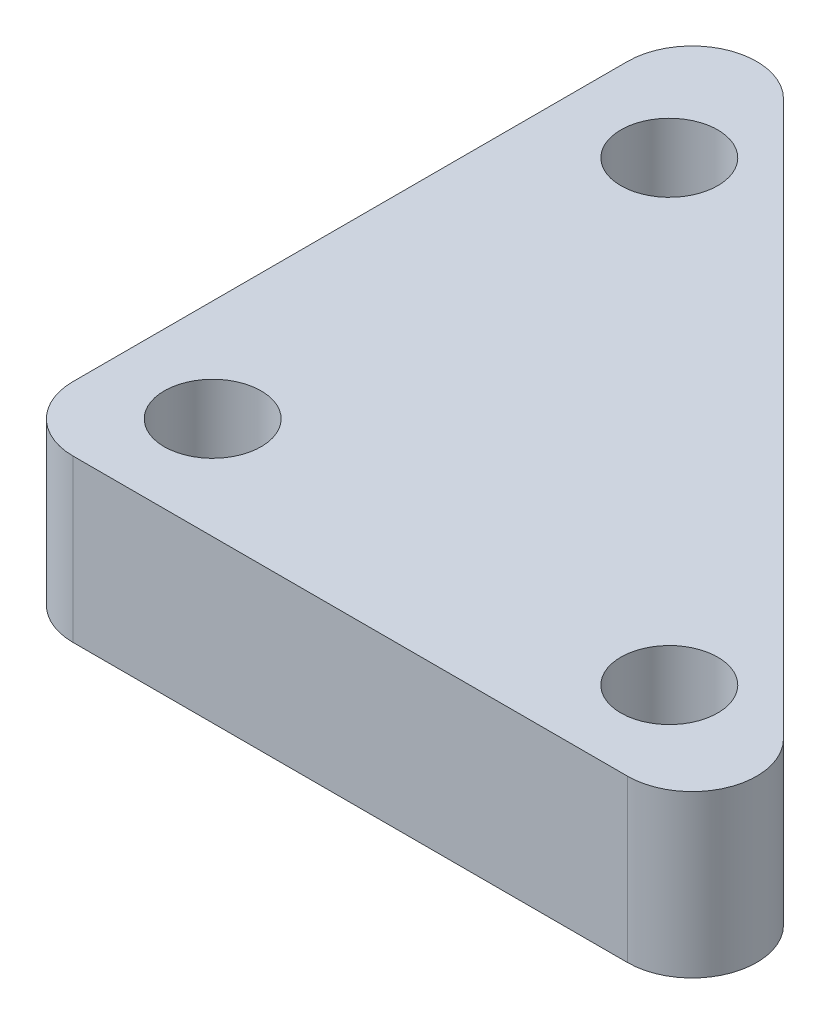
ISO-10303-21;
HEADER;
FILE_DESCRIPTION(('STEP AP214'),'2;1');
FILE_NAME('part.step','',(''),(''),'','','');
FILE_SCHEMA(('AUTOMOTIVE_DESIGN { 1 0 10303 214 1 1 1 1 }'));
ENDSEC;
DATA;
#1=APPLICATION_CONTEXT('core data for automotive mechanical design processes');
#2=APPLICATION_PROTOCOL_DEFINITION('international standard','automotive_design',2000,#1);
#3=PRODUCT_CONTEXT('',#1,'mechanical');
#4=PRODUCT('Part','Part','',(#3));
#5=PRODUCT_RELATED_PRODUCT_CATEGORY('part','',(#4));
#6=PRODUCT_DEFINITION_FORMATION('','',#4);
#7=PRODUCT_DEFINITION_CONTEXT('part definition',#1,'design');
#8=PRODUCT_DEFINITION('design','',#6,#7);
#9=PRODUCT_DEFINITION_SHAPE('','',#8);
#10=(LENGTH_UNIT() NAMED_UNIT(*) SI_UNIT(.MILLI.,.METRE.));
#11=(NAMED_UNIT(*) PLANE_ANGLE_UNIT() SI_UNIT($,.RADIAN.));
#12=(NAMED_UNIT(*) SI_UNIT($,.STERADIAN.) SOLID_ANGLE_UNIT());
#13=UNCERTAINTY_MEASURE_WITH_UNIT(LENGTH_MEASURE(1.E-05),#10,'distance_accuracy_value','');
#14=(GEOMETRIC_REPRESENTATION_CONTEXT(3) GLOBAL_UNCERTAINTY_ASSIGNED_CONTEXT((#13)) GLOBAL_UNIT_ASSIGNED_CONTEXT((#10,
#11,#12)) REPRESENTATION_CONTEXT('',''));
#15=CARTESIAN_POINT('',(0.,0.,0.));
#16=DIRECTION('',(0.,0.,1.));
#17=DIRECTION('',(1.,0.,0.));
#18=AXIS2_PLACEMENT_3D('',#15,#16,#17);
#19=CARTESIAN_POINT('',(-0.813390539394515,5.,17.6790433737398));
#20=DIRECTION('',(1.,0.,0.));
#21=DIRECTION('',(0.,0.,-1.));
#22=AXIS2_PLACEMENT_3D('',#19,#20,#21);
#23=PLANE('',#22);
#24=DIRECTION('',(0.,0.,1.));
#25=VECTOR('',#24,1.);
#26=CARTESIAN_POINT('',(-0.813390539394515,0.,17.6790433737398));
#27=LINE('',#26,#25);
#28=CARTESIAN_POINT('',(-0.813390539394515,0.,-1.49252950151403));
#29=VERTEX_POINT('',#28);
#30=CARTESIAN_POINT('',(-0.813390539394515,0.,15.6790433737398));
#31=VERTEX_POINT('',#30);
#32=EDGE_CURVE('E112',#29,#31,#27,.T.);
#33=ORIENTED_EDGE('',*,*,#32,.T.);
#34=DIRECTION('',(0.,-1.,0.));
#35=VECTOR('',#34,1.);
#36=CARTESIAN_POINT('',(-0.813390539394515,5.,15.6790433737398));
#37=LINE('',#36,#35);
#38=CARTESIAN_POINT('',(-0.813390539394515,5.,15.6790433737398));
#39=VERTEX_POINT('',#38);
#40=EDGE_CURVE('E91',#31,#39,#37,.F.);
#41=ORIENTED_EDGE('',*,*,#40,.T.);
#42=DIRECTION('',(0.,0.,1.));
#43=VECTOR('',#42,1.);
#44=CARTESIAN_POINT('',(-0.813390539394515,5.,17.6790433737398));
#45=LINE('',#44,#43);
#46=CARTESIAN_POINT('',(-0.813390539394515,5.,-1.49252950151403));
#47=VERTEX_POINT('',#46);
#48=EDGE_CURVE('E114',#47,#39,#45,.T.);
#49=ORIENTED_EDGE('',*,*,#48,.F.);
#50=DIRECTION('',(0.,-1.,0.));
#51=VECTOR('',#50,1.);
#52=CARTESIAN_POINT('',(-0.813390539394515,5.,-1.49252950151403));
#53=LINE('',#52,#51);
#54=EDGE_CURVE('E96',#47,#29,#53,.T.);
#55=ORIENTED_EDGE('',*,*,#54,.T.);
#56=EDGE_LOOP('',(#33,#41,#49,#55));
#57=FACE_BOUND('',#56,.T.);
#58=ADVANCED_FACE('F33',(#57),#23,.F.);
#59=CARTESIAN_POINT('',(-0.813390539394515,5.,17.6790433737398));
#60=DIRECTION('',(0.,0.,-1.));
#61=DIRECTION('',(-1.,0.,0.));
#62=AXIS2_PLACEMENT_3D('',#59,#60,#61);
#63=PLANE('',#62);
#64=DIRECTION('',(1.,0.,0.));
#65=VECTOR('',#64,1.);
#66=CARTESIAN_POINT('',(-0.813390539394515,5.,17.6790433737398));
#67=LINE('',#66,#65);
#68=CARTESIAN_POINT('',(1.18660946060549,5.,17.6790433737398));
#69=VERTEX_POINT('',#68);
#70=CARTESIAN_POINT('',(18.3581823358593,5.,17.6790433737398));
#71=VERTEX_POINT('',#70);
#72=EDGE_CURVE('E105',#69,#71,#67,.T.);
#73=ORIENTED_EDGE('',*,*,#72,.F.);
#74=DIRECTION('',(0.,-1.,0.));
#75=VECTOR('',#74,1.);
#76=CARTESIAN_POINT('',(1.18660946060549,5.,17.6790433737398));
#77=LINE('',#76,#75);
#78=CARTESIAN_POINT('',(1.18660946060549,0.,17.6790433737398));
#79=VERTEX_POINT('',#78);
#80=EDGE_CURVE('E90',#69,#79,#77,.T.);
#81=ORIENTED_EDGE('',*,*,#80,.T.);
#82=DIRECTION('',(1.,0.,0.));
#83=VECTOR('',#82,1.);
#84=CARTESIAN_POINT('',(-0.813390539394515,0.,17.6790433737398));
#85=LINE('',#84,#83);
#86=CARTESIAN_POINT('',(18.3581823358593,0.,17.6790433737398));
#87=VERTEX_POINT('',#86);
#88=EDGE_CURVE('E103',#79,#87,#85,.T.);
#89=ORIENTED_EDGE('',*,*,#88,.T.);
#90=DIRECTION('',(0.,-1.,0.));
#91=VECTOR('',#90,1.);
#92=CARTESIAN_POINT('',(18.3581823358593,5.,17.6790433737398));
#93=LINE('',#92,#91);
#94=EDGE_CURVE('E107',#87,#71,#93,.F.);
#95=ORIENTED_EDGE('',*,*,#94,.T.);
#96=EDGE_LOOP('',(#73,#81,#89,#95));
#97=FACE_BOUND('',#96,.T.);
#98=ADVANCED_FACE('F102',(#97),#63,.F.);
#99=CARTESIAN_POINT('',(-0.813390539394515,5.,-6.32095662626022));
#100=DIRECTION('',(-0.707106781186548,0.,0.707106781186548));
#101=DIRECTION('',(0.707106781186548,0.,0.707106781186548));
#102=AXIS2_PLACEMENT_3D('',#99,#100,#101);
#103=PLANE('',#102);
#104=DIRECTION('',(-0.707106781186548,0.,-0.707106781186548));
#105=VECTOR('',#104,1.);
#106=CARTESIAN_POINT('',(-0.813390539394515,0.,-6.32095662626022));
#107=LINE('',#106,#105);
#108=CARTESIAN_POINT('',(19.7723958982324,0.,14.2648298113667));
#109=VERTEX_POINT('',#108);
#110=CARTESIAN_POINT('',(2.60082302297858,0.,-2.90674306388713));
#111=VERTEX_POINT('',#110);
#112=EDGE_CURVE('E111',#109,#111,#107,.T.);
#113=ORIENTED_EDGE('',*,*,#112,.T.);
#114=DIRECTION('',(0.,-1.,0.));
#115=VECTOR('',#114,1.);
#116=CARTESIAN_POINT('',(2.60082302297858,5.,-2.90674306388713));
#117=LINE('',#116,#115);
#118=CARTESIAN_POINT('',(2.60082302297858,5.,-2.90674306388713));
#119=VERTEX_POINT('',#118);
#120=EDGE_CURVE('E11',#111,#119,#117,.F.);
#121=ORIENTED_EDGE('',*,*,#120,.T.);
#122=DIRECTION('',(-0.707106781186548,0.,-0.707106781186548));
#123=VECTOR('',#122,1.);
#124=CARTESIAN_POINT('',(-0.813390539394515,5.,-6.32095662626022));
#125=LINE('',#124,#123);
#126=CARTESIAN_POINT('',(19.7723958982324,5.,14.2648298113667));
#127=VERTEX_POINT('',#126);
#128=EDGE_CURVE('E120',#127,#119,#125,.T.);
#129=ORIENTED_EDGE('',*,*,#128,.F.);
#130=DIRECTION('',(0.,-1.,0.));
#131=VECTOR('',#130,1.);
#132=CARTESIAN_POINT('',(19.7723958982324,5.,14.2648298113667));
#133=LINE('',#132,#131);
#134=EDGE_CURVE('E41',#127,#109,#133,.T.);
#135=ORIENTED_EDGE('',*,*,#134,.T.);
#136=EDGE_LOOP('',(#113,#121,#129,#135));
#137=FACE_BOUND('',#136,.T.);
#138=ADVANCED_FACE('F133',(#137),#103,.F.);
#139=CARTESIAN_POINT('',(0.,5.,0.));
#140=DIRECTION('',(0.,-1.,0.));
#141=DIRECTION('',(0.,0.,-1.));
#142=AXIS2_PLACEMENT_3D('',#139,#140,#141);
#143=PLANE('',#142);
#144=CARTESIAN_POINT('',(16.5603777134606,5.,14.5883455325277));
#145=DIRECTION('',(0.,1.,0.));
#146=DIRECTION('',(0.,0.,1.));
#147=AXIS2_PLACEMENT_3D('',#144,#145,#146);
#148=CIRCLE('',#147,1.5);
#149=CARTESIAN_POINT('',(16.5603777134606,5.,16.0883455325277));
#150=VERTEX_POINT('',#149);
#151=EDGE_CURVE('E197',#150,#150,#148,.T.);
#152=ORIENTED_EDGE('',*,*,#151,.F.);
#153=EDGE_LOOP('',(#152));
#154=FACE_BOUND('',#153,.T.);
#155=CARTESIAN_POINT('',(2.41824208972967,5.,0.446209908796702));
#156=DIRECTION('',(0.,1.,0.));
#157=DIRECTION('',(0.,0.,1.));
#158=AXIS2_PLACEMENT_3D('',#155,#156,#157);
#159=CIRCLE('',#158,1.5);
#160=CARTESIAN_POINT('',(2.41824208972967,5.,1.9462099087967));
#161=VERTEX_POINT('',#160);
#162=EDGE_CURVE('E199',#161,#161,#159,.T.);
#163=ORIENTED_EDGE('',*,*,#162,.F.);
#164=EDGE_LOOP('',(#163));
#165=FACE_BOUND('',#164,.T.);
#166=CARTESIAN_POINT('',(2.34777469577364,5.,14.5178781385716));
#167=DIRECTION('',(0.,1.,0.));
#168=DIRECTION('',(0.,0.,1.));
#169=AXIS2_PLACEMENT_3D('',#166,#167,#168);
#170=CIRCLE('',#169,1.5);
#171=CARTESIAN_POINT('',(2.34777469577364,5.,16.0178781385716));
#172=VERTEX_POINT('',#171);
#173=EDGE_CURVE('E145',#172,#172,#170,.T.);
#174=ORIENTED_EDGE('',*,*,#173,.F.);
#175=EDGE_LOOP('',(#174));
#176=FACE_BOUND('',#175,.T.);
#177=ORIENTED_EDGE('',*,*,#48,.T.);
#178=CARTESIAN_POINT('',(1.18660946060549,5.,15.6790433737398));
#179=DIRECTION('',(0.,-1.,0.));
#180=DIRECTION('',(0.,0.,-1.));
#181=AXIS2_PLACEMENT_3D('',#178,#179,#180);
#182=CIRCLE('',#181,2.);
#183=EDGE_CURVE('E130',#39,#69,#182,.F.);
#184=ORIENTED_EDGE('',*,*,#183,.T.);
#185=ORIENTED_EDGE('',*,*,#72,.T.);
#186=CARTESIAN_POINT('',(18.3581823358593,5.,15.6790433737398));
#187=DIRECTION('',(0.,-1.,0.));
#188=DIRECTION('',(0.,0.,-1.));
#189=AXIS2_PLACEMENT_3D('',#186,#187,#188);
#190=CIRCLE('',#189,2.);
#191=EDGE_CURVE('E53',#71,#127,#190,.F.);
#192=ORIENTED_EDGE('',*,*,#191,.T.);
#193=ORIENTED_EDGE('',*,*,#128,.T.);
#194=CARTESIAN_POINT('',(1.18660946060549,5.,-1.49252950151403));
#195=DIRECTION('',(0.,-1.,0.));
#196=DIRECTION('',(0.,0.,-1.));
#197=AXIS2_PLACEMENT_3D('',#194,#195,#196);
#198=CIRCLE('',#197,2.);
#199=EDGE_CURVE('E128',#119,#47,#198,.F.);
#200=ORIENTED_EDGE('',*,*,#199,.T.);
#201=EDGE_LOOP('',(#177,#184,#185,#192,#193,#200));
#202=FACE_BOUND('',#201,.T.);
#203=ADVANCED_FACE('F147',(#154,#165,#176,#202),#143,.F.);
#204=CARTESIAN_POINT('',(0.,0.,0.));
#205=DIRECTION('',(0.,-1.,0.));
#206=DIRECTION('',(0.,0.,-1.));
#207=AXIS2_PLACEMENT_3D('',#204,#205,#206);
#208=PLANE('',#207);
#209=CARTESIAN_POINT('',(16.5603777134606,0.,14.5883455325277));
#210=DIRECTION('',(0.,1.,0.));
#211=DIRECTION('',(0.,0.,1.));
#212=AXIS2_PLACEMENT_3D('',#209,#210,#211);
#213=CIRCLE('',#212,1.5);
#214=CARTESIAN_POINT('',(16.5603777134606,0.,16.0883455325277));
#215=VERTEX_POINT('',#214);
#216=EDGE_CURVE('E195',#215,#215,#213,.T.);
#217=ORIENTED_EDGE('',*,*,#216,.T.);
#218=EDGE_LOOP('',(#217));
#219=FACE_BOUND('',#218,.T.);
#220=CARTESIAN_POINT('',(2.41824208972967,0.,0.446209908796702));
#221=DIRECTION('',(0.,1.,0.));
#222=DIRECTION('',(0.,0.,1.));
#223=AXIS2_PLACEMENT_3D('',#220,#221,#222);
#224=CIRCLE('',#223,1.5);
#225=CARTESIAN_POINT('',(2.41824208972967,0.,1.9462099087967));
#226=VERTEX_POINT('',#225);
#227=EDGE_CURVE('E202',#226,#226,#224,.T.);
#228=ORIENTED_EDGE('',*,*,#227,.T.);
#229=EDGE_LOOP('',(#228));
#230=FACE_BOUND('',#229,.T.);
#231=CARTESIAN_POINT('',(2.34777469577364,0.,14.5178781385716));
#232=DIRECTION('',(0.,1.,0.));
#233=DIRECTION('',(0.,0.,1.));
#234=AXIS2_PLACEMENT_3D('',#231,#232,#233);
#235=CIRCLE('',#234,1.5);
#236=CARTESIAN_POINT('',(2.34777469577364,0.,16.0178781385716));
#237=VERTEX_POINT('',#236);
#238=EDGE_CURVE('E116',#237,#237,#235,.T.);
#239=ORIENTED_EDGE('',*,*,#238,.T.);
#240=EDGE_LOOP('',(#239));
#241=FACE_BOUND('',#240,.T.);
#242=ORIENTED_EDGE('',*,*,#88,.F.);
#243=CARTESIAN_POINT('',(1.18660946060549,0.,15.6790433737398));
#244=DIRECTION('',(0.,-1.,0.));
#245=DIRECTION('',(0.,0.,-1.));
#246=AXIS2_PLACEMENT_3D('',#243,#244,#245);
#247=CIRCLE('',#246,2.);
#248=EDGE_CURVE('E86',#79,#31,#247,.T.);
#249=ORIENTED_EDGE('',*,*,#248,.T.);
#250=ORIENTED_EDGE('',*,*,#32,.F.);
#251=CARTESIAN_POINT('',(1.18660946060549,0.,-1.49252950151403));
#252=DIRECTION('',(0.,-1.,0.));
#253=DIRECTION('',(0.,0.,-1.));
#254=AXIS2_PLACEMENT_3D('',#251,#252,#253);
#255=CIRCLE('',#254,2.);
#256=EDGE_CURVE('E97',#29,#111,#255,.T.);
#257=ORIENTED_EDGE('',*,*,#256,.T.);
#258=ORIENTED_EDGE('',*,*,#112,.F.);
#259=CARTESIAN_POINT('',(18.3581823358593,0.,15.6790433737398));
#260=DIRECTION('',(0.,-1.,0.));
#261=DIRECTION('',(0.,0.,-1.));
#262=AXIS2_PLACEMENT_3D('',#259,#260,#261);
#263=CIRCLE('',#262,2.);
#264=EDGE_CURVE('E106',#109,#87,#263,.T.);
#265=ORIENTED_EDGE('',*,*,#264,.T.);
#266=EDGE_LOOP('',(#242,#249,#250,#257,#258,#265));
#267=FACE_BOUND('',#266,.T.);
#268=ADVANCED_FACE('F109',(#219,#230,#241,#267),#208,.T.);
#269=CARTESIAN_POINT('',(1.18660946060549,5.,15.6790433737398));
#270=DIRECTION('',(0.,-1.,0.));
#271=DIRECTION('',(0.,0.,-1.));
#272=AXIS2_PLACEMENT_3D('',#269,#270,#271);
#273=CYLINDRICAL_SURFACE('',#272,2.);
#274=ORIENTED_EDGE('',*,*,#183,.F.);
#275=ORIENTED_EDGE('',*,*,#40,.F.);
#276=ORIENTED_EDGE('',*,*,#248,.F.);
#277=ORIENTED_EDGE('',*,*,#80,.F.);
#278=EDGE_LOOP('',(#274,#275,#276,#277));
#279=FACE_BOUND('',#278,.T.);
#280=ADVANCED_FACE('F89',(#279),#273,.T.);
#281=CARTESIAN_POINT('',(1.18660946060549,5.,-1.49252950151403));
#282=DIRECTION('',(0.,-1.,0.));
#283=DIRECTION('',(0.,0.,-1.));
#284=AXIS2_PLACEMENT_3D('',#281,#282,#283);
#285=CYLINDRICAL_SURFACE('',#284,2.);
#286=ORIENTED_EDGE('',*,*,#199,.F.);
#287=ORIENTED_EDGE('',*,*,#120,.F.);
#288=ORIENTED_EDGE('',*,*,#256,.F.);
#289=ORIENTED_EDGE('',*,*,#54,.F.);
#290=EDGE_LOOP('',(#286,#287,#288,#289));
#291=FACE_BOUND('',#290,.T.);
#292=ADVANCED_FACE('F138',(#291),#285,.T.);
#293=CARTESIAN_POINT('',(18.3581823358593,5.,15.6790433737398));
#294=DIRECTION('',(0.,-1.,0.));
#295=DIRECTION('',(0.,0.,-1.));
#296=AXIS2_PLACEMENT_3D('',#293,#294,#295);
#297=CYLINDRICAL_SURFACE('',#296,2.);
#298=ORIENTED_EDGE('',*,*,#191,.F.);
#299=ORIENTED_EDGE('',*,*,#94,.F.);
#300=ORIENTED_EDGE('',*,*,#264,.F.);
#301=ORIENTED_EDGE('',*,*,#134,.F.);
#302=EDGE_LOOP('',(#298,#299,#300,#301));
#303=FACE_BOUND('',#302,.T.);
#304=ADVANCED_FACE('F35',(#303),#297,.T.);
#305=CARTESIAN_POINT('',(2.34777469577364,0.,14.5178781385716));
#306=DIRECTION('',(0.,1.,0.));
#307=DIRECTION('',(0.,0.,1.));
#308=AXIS2_PLACEMENT_3D('',#305,#306,#307);
#309=CYLINDRICAL_SURFACE('',#308,1.5);
#310=ORIENTED_EDGE('',*,*,#238,.F.);
#311=EDGE_LOOP('',(#310));
#312=FACE_BOUND('',#311,.T.);
#313=ORIENTED_EDGE('',*,*,#173,.T.);
#314=EDGE_LOOP('',(#313));
#315=FACE_BOUND('',#314,.T.);
#316=ADVANCED_FACE('F173',(#312,#315),#309,.F.);
#317=CARTESIAN_POINT('',(2.41824208972967,0.,0.446209908796702));
#318=DIRECTION('',(0.,1.,0.));
#319=DIRECTION('',(0.,0.,1.));
#320=AXIS2_PLACEMENT_3D('',#317,#318,#319);
#321=CYLINDRICAL_SURFACE('',#320,1.5);
#322=ORIENTED_EDGE('',*,*,#227,.F.);
#323=EDGE_LOOP('',(#322));
#324=FACE_BOUND('',#323,.T.);
#325=ORIENTED_EDGE('',*,*,#162,.T.);
#326=EDGE_LOOP('',(#325));
#327=FACE_BOUND('',#326,.T.);
#328=ADVANCED_FACE('F177',(#324,#327),#321,.F.);
#329=CARTESIAN_POINT('',(16.5603777134606,0.,14.5883455325277));
#330=DIRECTION('',(0.,1.,0.));
#331=DIRECTION('',(0.,0.,1.));
#332=AXIS2_PLACEMENT_3D('',#329,#330,#331);
#333=CYLINDRICAL_SURFACE('',#332,1.5);
#334=ORIENTED_EDGE('',*,*,#216,.F.);
#335=EDGE_LOOP('',(#334));
#336=FACE_BOUND('',#335,.T.);
#337=ORIENTED_EDGE('',*,*,#151,.T.);
#338=EDGE_LOOP('',(#337));
#339=FACE_BOUND('',#338,.T.);
#340=ADVANCED_FACE('F182',(#336,#339),#333,.F.);
#341=CLOSED_SHELL('',(#58,#98,#138,#203,#268,#280,#292,#304,#316,#328,#340));
#342=MANIFOLD_SOLID_BREP('B2',#341);
#343=ADVANCED_BREP_SHAPE_REPRESENTATION('',(#18,#342),#14);
#344=SHAPE_DEFINITION_REPRESENTATION(#9,#343);
ENDSEC;
END-ISO-10303-21;
